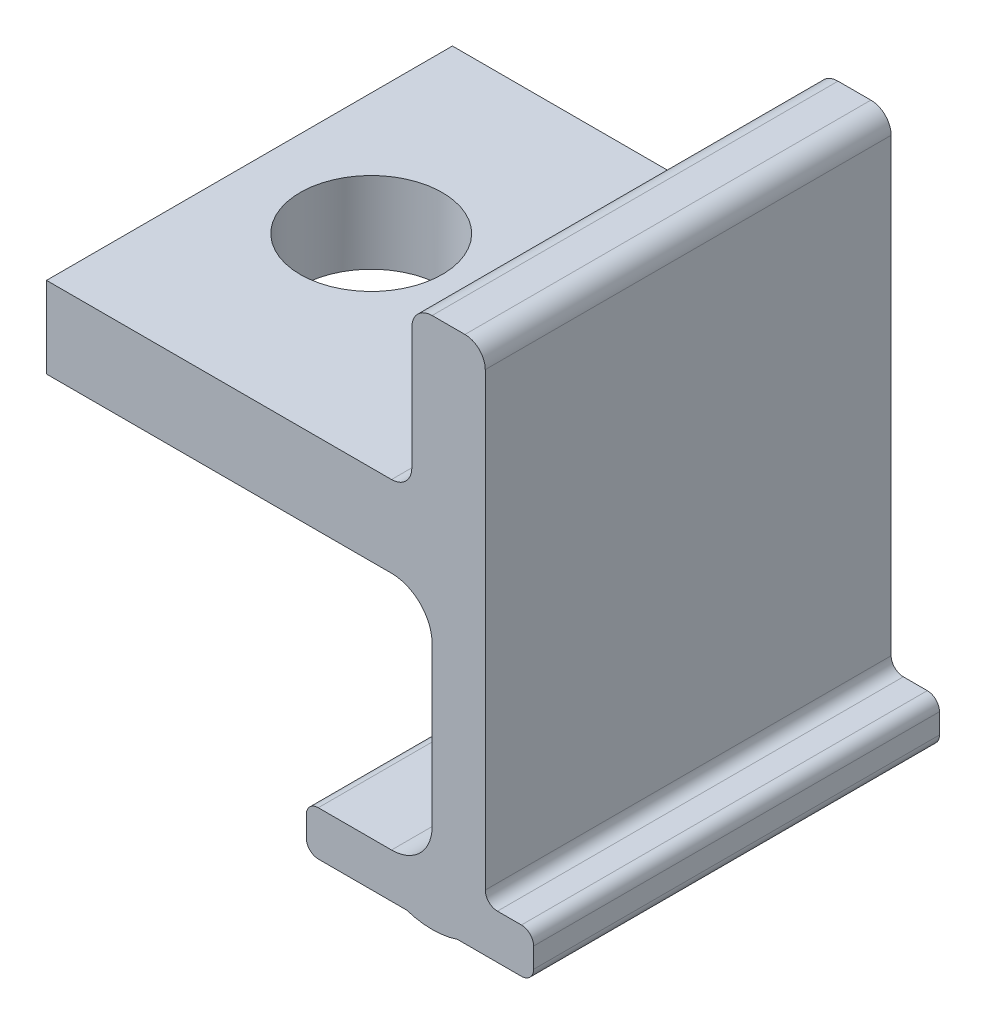
ISO-10303-21;
HEADER;
FILE_DESCRIPTION(('STEP AP214'),'2;1');
FILE_NAME('part.step','',(''),(''),'','','');
FILE_SCHEMA(('AUTOMOTIVE_DESIGN { 1 0 10303 214 1 1 1 1 }'));
ENDSEC;
DATA;
#1=APPLICATION_CONTEXT('core data for automotive mechanical design processes');
#2=APPLICATION_PROTOCOL_DEFINITION('international standard','automotive_design',2000,#1);
#3=PRODUCT_CONTEXT('',#1,'mechanical');
#4=PRODUCT('Part','Part','',(#3));
#5=PRODUCT_RELATED_PRODUCT_CATEGORY('part','',(#4));
#6=PRODUCT_DEFINITION_FORMATION('','',#4);
#7=PRODUCT_DEFINITION_CONTEXT('part definition',#1,'design');
#8=PRODUCT_DEFINITION('design','',#6,#7);
#9=PRODUCT_DEFINITION_SHAPE('','',#8);
#10=(LENGTH_UNIT() NAMED_UNIT(*) SI_UNIT(.MILLI.,.METRE.));
#11=(NAMED_UNIT(*) PLANE_ANGLE_UNIT() SI_UNIT($,.RADIAN.));
#12=(NAMED_UNIT(*) SI_UNIT($,.STERADIAN.) SOLID_ANGLE_UNIT());
#13=UNCERTAINTY_MEASURE_WITH_UNIT(LENGTH_MEASURE(1.E-05),#10,'distance_accuracy_value','');
#14=(GEOMETRIC_REPRESENTATION_CONTEXT(3) GLOBAL_UNCERTAINTY_ASSIGNED_CONTEXT((#13)) GLOBAL_UNIT_ASSIGNED_CONTEXT((#10,
#11,#12)) REPRESENTATION_CONTEXT('',''));
#15=CARTESIAN_POINT('',(0.,0.,0.));
#16=DIRECTION('',(0.,0.,1.));
#17=DIRECTION('',(1.,0.,0.));
#18=AXIS2_PLACEMENT_3D('',#15,#16,#17);
#19=CARTESIAN_POINT('',(5.76408133465163,-7.90419601084502,0.));
#20=DIRECTION('',(0.,-1.,0.));
#21=DIRECTION('',(0.,0.,-1.));
#22=AXIS2_PLACEMENT_3D('',#19,#20,#21);
#23=PLANE('',#22);
#24=DIRECTION('',(0.,0.,1.));
#25=VECTOR('',#24,1.);
#26=CARTESIAN_POINT('',(6.69580398915498,-7.90419601084502,0.));
#27=LINE('',#26,#25);
#28=CARTESIAN_POINT('',(6.69580398915498,-7.90419601084502,0.));
#29=VERTEX_POINT('',#28);
#30=CARTESIAN_POINT('',(6.69580398915498,-7.90419601084502,10.));
#31=VERTEX_POINT('',#30);
#32=EDGE_CURVE('E200',#29,#31,#27,.T.);
#33=ORIENTED_EDGE('',*,*,#32,.T.);
#34=DIRECTION('',(1.,0.,0.));
#35=VECTOR('',#34,1.);
#36=CARTESIAN_POINT('',(5.76408133465163,-7.90419601084502,10.));
#37=LINE('',#36,#35);
#38=CARTESIAN_POINT('',(8.5,-7.90419601084502,10.));
#39=VERTEX_POINT('',#38);
#40=EDGE_CURVE('E219',#31,#39,#37,.T.);
#41=ORIENTED_EDGE('',*,*,#40,.T.);
#42=DIRECTION('',(0.,0.,1.));
#43=VECTOR('',#42,1.);
#44=CARTESIAN_POINT('',(8.5,-7.90419601084502,0.));
#45=LINE('',#44,#43);
#46=CARTESIAN_POINT('',(8.5,-7.90419601084502,0.));
#47=VERTEX_POINT('',#46);
#48=EDGE_CURVE('E218',#47,#39,#45,.T.);
#49=ORIENTED_EDGE('',*,*,#48,.F.);
#50=DIRECTION('',(-1.,0.,0.));
#51=VECTOR('',#50,1.);
#52=CARTESIAN_POINT('',(8.5,-7.90419601084502,0.));
#53=LINE('',#52,#51);
#54=EDGE_CURVE('E11',#47,#29,#53,.T.);
#55=ORIENTED_EDGE('',*,*,#54,.T.);
#56=EDGE_LOOP('',(#33,#41,#49,#55));
#57=FACE_BOUND('',#56,.T.);
#58=ADVANCED_FACE('F40',(#57),#23,.F.);
#59=CARTESIAN_POINT('',(0.,-2.,10.));
#60=DIRECTION('',(1.,0.,0.));
#61=DIRECTION('',(0.,0.,-1.));
#62=AXIS2_PLACEMENT_3D('',#59,#60,#61);
#63=PLANE('',#62);
#64=DIRECTION('',(0.,-1.,0.));
#65=VECTOR('',#64,1.);
#66=CARTESIAN_POINT('',(0.,-2.,0.));
#67=LINE('',#66,#65);
#68=CARTESIAN_POINT('',(0.,0.,0.));
#69=VERTEX_POINT('',#68);
#70=CARTESIAN_POINT('',(0.,-2.,0.));
#71=VERTEX_POINT('',#70);
#72=EDGE_CURVE('E274',#69,#71,#67,.T.);
#73=ORIENTED_EDGE('',*,*,#72,.T.);
#74=DIRECTION('',(0.,0.,-1.));
#75=VECTOR('',#74,1.);
#76=CARTESIAN_POINT('',(0.,-2.,10.));
#77=LINE('',#76,#75);
#78=CARTESIAN_POINT('',(0.,-2.,10.));
#79=VERTEX_POINT('',#78);
#80=EDGE_CURVE('E48',#79,#71,#77,.T.);
#81=ORIENTED_EDGE('',*,*,#80,.F.);
#82=DIRECTION('',(0.,-1.,0.));
#83=VECTOR('',#82,1.);
#84=CARTESIAN_POINT('',(0.,-2.,10.));
#85=LINE('',#84,#83);
#86=CARTESIAN_POINT('',(0.,0.,10.));
#87=VERTEX_POINT('',#86);
#88=EDGE_CURVE('E237',#87,#79,#85,.T.);
#89=ORIENTED_EDGE('',*,*,#88,.F.);
#90=DIRECTION('',(0.,0.,-1.));
#91=VECTOR('',#90,1.);
#92=CARTESIAN_POINT('',(0.,0.,10.));
#93=LINE('',#92,#91);
#94=EDGE_CURVE('E273',#87,#69,#93,.T.);
#95=ORIENTED_EDGE('',*,*,#94,.T.);
#96=EDGE_LOOP('',(#73,#81,#89,#95));
#97=FACE_BOUND('',#96,.T.);
#98=ADVANCED_FACE('F42',(#97),#63,.F.);
#99=CARTESIAN_POINT('',(6.3,-2.,10.));
#100=DIRECTION('',(0.,1.,0.));
#101=DIRECTION('',(-1.,0.,0.));
#102=AXIS2_PLACEMENT_3D('',#99,#100,#101);
#103=PLANE('',#102);
#104=CARTESIAN_POINT('',(3.00000000000038,-2.,4.99999999999996));
#105=DIRECTION('',(0.,1.,0.));
#106=DIRECTION('',(-1.,0.,0.));
#107=AXIS2_PLACEMENT_3D('',#104,#105,#106);
#108=CIRCLE('',#107,1.75);
#109=CARTESIAN_POINT('',(1.25000000000038,-2.,4.99999999999996));
#110=VERTEX_POINT('',#109);
#111=EDGE_CURVE('E235',#110,#110,#108,.T.);
#112=ORIENTED_EDGE('',*,*,#111,.T.);
#113=EDGE_LOOP('',(#112));
#114=FACE_BOUND('',#113,.T.);
#115=DIRECTION('',(1.,0.,0.));
#116=VECTOR('',#115,1.);
#117=CARTESIAN_POINT('',(6.3,-2.,0.));
#118=LINE('',#117,#116);
#119=CARTESIAN_POINT('',(8.5,-2.,0.));
#120=VERTEX_POINT('',#119);
#121=EDGE_CURVE('E277',#71,#120,#118,.T.);
#122=ORIENTED_EDGE('',*,*,#121,.T.);
#123=DIRECTION('',(0.,0.,1.));
#124=VECTOR('',#123,1.);
#125=CARTESIAN_POINT('',(8.5,-2.,0.));
#126=LINE('',#125,#124);
#127=CARTESIAN_POINT('',(8.5,-2.,10.));
#128=VERTEX_POINT('',#127);
#129=EDGE_CURVE('E236',#120,#128,#126,.T.);
#130=ORIENTED_EDGE('',*,*,#129,.T.);
#131=DIRECTION('',(1.,0.,0.));
#132=VECTOR('',#131,1.);
#133=CARTESIAN_POINT('',(6.3,-2.,10.));
#134=LINE('',#133,#132);
#135=EDGE_CURVE('E240',#79,#128,#134,.T.);
#136=ORIENTED_EDGE('',*,*,#135,.F.);
#137=ORIENTED_EDGE('',*,*,#80,.T.);
#138=EDGE_LOOP('',(#122,#130,#136,#137));
#139=FACE_BOUND('',#138,.T.);
#140=ADVANCED_FACE('F357',(#114,#139),#103,.F.);
#141=CARTESIAN_POINT('',(8.87550020016016,-9.,10.));
#142=DIRECTION('',(0.,1.,0.));
#143=DIRECTION('',(-1.,0.,0.));
#144=AXIS2_PLACEMENT_3D('',#141,#142,#143);
#145=PLANE('',#144);
#146=DIRECTION('',(1.,0.,0.));
#147=VECTOR('',#146,1.);
#148=CARTESIAN_POINT('',(8.87550020016016,-9.,10.));
#149=LINE('',#148,#147);
#150=CARTESIAN_POINT('',(6.7,-9.,10.));
#151=VERTEX_POINT('',#150);
#152=CARTESIAN_POINT('',(8.87550020016016,-9.,10.));
#153=VERTEX_POINT('',#152);
#154=EDGE_CURVE('E243',#151,#153,#149,.T.);
#155=ORIENTED_EDGE('',*,*,#154,.F.);
#156=DIRECTION('',(0.,0.,1.));
#157=VECTOR('',#156,1.);
#158=CARTESIAN_POINT('',(6.7,-9.,0.));
#159=LINE('',#158,#157);
#160=CARTESIAN_POINT('',(6.7,-9.,0.));
#161=VERTEX_POINT('',#160);
#162=EDGE_CURVE('E207',#161,#151,#159,.T.);
#163=ORIENTED_EDGE('',*,*,#162,.F.);
#164=DIRECTION('',(1.,0.,0.));
#165=VECTOR('',#164,1.);
#166=CARTESIAN_POINT('',(8.87550020016016,-9.,0.));
#167=LINE('',#166,#165);
#168=CARTESIAN_POINT('',(8.87550020016016,-9.,0.));
#169=VERTEX_POINT('',#168);
#170=EDGE_CURVE('E279',#161,#169,#167,.T.);
#171=ORIENTED_EDGE('',*,*,#170,.T.);
#172=DIRECTION('',(0.,0.,-1.));
#173=VECTOR('',#172,1.);
#174=CARTESIAN_POINT('',(8.87550020016016,-9.,10.));
#175=LINE('',#174,#173);
#176=EDGE_CURVE('E350',#153,#169,#175,.T.);
#177=ORIENTED_EDGE('',*,*,#176,.F.);
#178=EDGE_LOOP('',(#155,#163,#171,#177));
#179=FACE_BOUND('',#178,.T.);
#180=ADVANCED_FACE('F510',(#179),#145,.F.);
#181=CARTESIAN_POINT('',(9.5,-7.1,10.));
#182=DIRECTION('',(0.,0.,-1.));
#183=DIRECTION('',(-1.,0.,0.));
#184=AXIS2_PLACEMENT_3D('',#181,#182,#183);
#185=CYLINDRICAL_SURFACE('',#184,2.);
#186=CARTESIAN_POINT('',(9.5,-7.1,0.));
#187=DIRECTION('',(0.,0.,1.));
#188=DIRECTION('',(1.,0.,0.));
#189=AXIS2_PLACEMENT_3D('',#186,#187,#188);
#190=CIRCLE('',#189,2.);
#191=CARTESIAN_POINT('',(10.1244997998398,-9.,0.));
#192=VERTEX_POINT('',#191);
#193=EDGE_CURVE('E281',#169,#192,#190,.T.);
#194=ORIENTED_EDGE('',*,*,#193,.T.);
#195=DIRECTION('',(0.,0.,-1.));
#196=VECTOR('',#195,1.);
#197=CARTESIAN_POINT('',(10.1244997998398,-9.,10.));
#198=LINE('',#197,#196);
#199=CARTESIAN_POINT('',(10.1244997998398,-9.,10.));
#200=VERTEX_POINT('',#199);
#201=EDGE_CURVE('E347',#200,#192,#198,.T.);
#202=ORIENTED_EDGE('',*,*,#201,.F.);
#203=CARTESIAN_POINT('',(9.5,-7.1,10.));
#204=DIRECTION('',(0.,0.,1.));
#205=DIRECTION('',(1.,0.,0.));
#206=AXIS2_PLACEMENT_3D('',#203,#204,#205);
#207=CIRCLE('',#206,2.);
#208=EDGE_CURVE('E245',#153,#200,#207,.T.);
#209=ORIENTED_EDGE('',*,*,#208,.F.);
#210=ORIENTED_EDGE('',*,*,#176,.T.);
#211=EDGE_LOOP('',(#194,#202,#209,#210));
#212=FACE_BOUND('',#211,.T.);
#213=ADVANCED_FACE('F506',(#212),#185,.T.);
#214=CARTESIAN_POINT('',(11.7,-9.,10.));
#215=DIRECTION('',(0.,1.,0.));
#216=DIRECTION('',(0.,0.,1.));
#217=AXIS2_PLACEMENT_3D('',#214,#215,#216);
#218=PLANE('',#217);
#219=DIRECTION('',(1.,0.,0.));
#220=VECTOR('',#219,1.);
#221=CARTESIAN_POINT('',(11.7,-9.,0.));
#222=LINE('',#221,#220);
#223=CARTESIAN_POINT('',(11.7,-9.,0.));
#224=VERTEX_POINT('',#223);
#225=EDGE_CURVE('E283',#192,#224,#222,.T.);
#226=ORIENTED_EDGE('',*,*,#225,.T.);
#227=DIRECTION('',(0.,0.,-1.));
#228=VECTOR('',#227,1.);
#229=CARTESIAN_POINT('',(11.7,-9.,10.));
#230=LINE('',#229,#228);
#231=CARTESIAN_POINT('',(11.7,-9.,10.));
#232=VERTEX_POINT('',#231);
#233=EDGE_CURVE('E344',#232,#224,#230,.T.);
#234=ORIENTED_EDGE('',*,*,#233,.F.);
#235=DIRECTION('',(1.,0.,0.));
#236=VECTOR('',#235,1.);
#237=CARTESIAN_POINT('',(11.7,-9.,10.));
#238=LINE('',#237,#236);
#239=EDGE_CURVE('E247',#200,#232,#238,.T.);
#240=ORIENTED_EDGE('',*,*,#239,.F.);
#241=ORIENTED_EDGE('',*,*,#201,.T.);
#242=EDGE_LOOP('',(#226,#234,#240,#241));
#243=FACE_BOUND('',#242,.T.);
#244=ADVANCED_FACE('F501',(#243),#218,.F.);
#245=CARTESIAN_POINT('',(11.7,-8.7,10.));
#246=DIRECTION('',(0.,0.,-1.));
#247=DIRECTION('',(-1.,0.,0.));
#248=AXIS2_PLACEMENT_3D('',#245,#246,#247);
#249=CYLINDRICAL_SURFACE('',#248,0.3);
#250=CARTESIAN_POINT('',(11.7,-8.7,0.));
#251=DIRECTION('',(0.,0.,1.));
#252=DIRECTION('',(-1.,0.,0.));
#253=AXIS2_PLACEMENT_3D('',#250,#251,#252);
#254=CIRCLE('',#253,0.3);
#255=CARTESIAN_POINT('',(12.,-8.7,0.));
#256=VERTEX_POINT('',#255);
#257=EDGE_CURVE('E285',#224,#256,#254,.T.);
#258=ORIENTED_EDGE('',*,*,#257,.T.);
#259=DIRECTION('',(0.,0.,-1.));
#260=VECTOR('',#259,1.);
#261=CARTESIAN_POINT('',(12.,-8.7,10.));
#262=LINE('',#261,#260);
#263=CARTESIAN_POINT('',(12.,-8.7,10.));
#264=VERTEX_POINT('',#263);
#265=EDGE_CURVE('E341',#264,#256,#262,.T.);
#266=ORIENTED_EDGE('',*,*,#265,.F.);
#267=CARTESIAN_POINT('',(11.7,-8.7,10.));
#268=DIRECTION('',(0.,0.,1.));
#269=DIRECTION('',(-1.,0.,0.));
#270=AXIS2_PLACEMENT_3D('',#267,#268,#269);
#271=CIRCLE('',#270,0.3);
#272=EDGE_CURVE('E249',#232,#264,#271,.T.);
#273=ORIENTED_EDGE('',*,*,#272,.F.);
#274=ORIENTED_EDGE('',*,*,#233,.T.);
#275=EDGE_LOOP('',(#258,#266,#273,#274));
#276=FACE_BOUND('',#275,.T.);
#277=ADVANCED_FACE('F495',(#276),#249,.T.);
#278=CARTESIAN_POINT('',(12.,-8.7,10.));
#279=DIRECTION('',(-1.,0.,0.));
#280=DIRECTION('',(0.,-1.,0.));
#281=AXIS2_PLACEMENT_3D('',#278,#279,#280);
#282=PLANE('',#281);
#283=DIRECTION('',(0.,1.,0.));
#284=VECTOR('',#283,1.);
#285=CARTESIAN_POINT('',(12.,-8.7,0.));
#286=LINE('',#285,#284);
#287=CARTESIAN_POINT('',(12.,-8.20419601084502,0.));
#288=VERTEX_POINT('',#287);
#289=EDGE_CURVE('E287',#256,#288,#286,.T.);
#290=ORIENTED_EDGE('',*,*,#289,.T.);
#291=DIRECTION('',(0.,0.,-1.));
#292=VECTOR('',#291,1.);
#293=CARTESIAN_POINT('',(12.,-8.20419601084502,10.));
#294=LINE('',#293,#292);
#295=CARTESIAN_POINT('',(12.,-8.20419601084502,10.));
#296=VERTEX_POINT('',#295);
#297=EDGE_CURVE('E338',#296,#288,#294,.T.);
#298=ORIENTED_EDGE('',*,*,#297,.F.);
#299=DIRECTION('',(0.,1.,0.));
#300=VECTOR('',#299,1.);
#301=CARTESIAN_POINT('',(12.,-8.7,10.));
#302=LINE('',#301,#300);
#303=EDGE_CURVE('E251',#264,#296,#302,.T.);
#304=ORIENTED_EDGE('',*,*,#303,.F.);
#305=ORIENTED_EDGE('',*,*,#265,.T.);
#306=EDGE_LOOP('',(#290,#298,#304,#305));
#307=FACE_BOUND('',#306,.T.);
#308=ADVANCED_FACE('F491',(#307),#282,.F.);
#309=CARTESIAN_POINT('',(11.7,-8.20419601084502,10.));
#310=DIRECTION('',(0.,0.,-1.));
#311=DIRECTION('',(-1.,0.,0.));
#312=AXIS2_PLACEMENT_3D('',#309,#310,#311);
#313=CYLINDRICAL_SURFACE('',#312,0.300000000000001);
#314=CARTESIAN_POINT('',(11.7,-8.20419601084502,0.));
#315=DIRECTION('',(0.,0.,1.));
#316=DIRECTION('',(1.,0.,0.));
#317=AXIS2_PLACEMENT_3D('',#314,#315,#316);
#318=CIRCLE('',#317,0.300000000000001);
#319=CARTESIAN_POINT('',(11.7,-7.90419601084501,0.));
#320=VERTEX_POINT('',#319);
#321=EDGE_CURVE('E289',#288,#320,#318,.T.);
#322=ORIENTED_EDGE('',*,*,#321,.T.);
#323=DIRECTION('',(0.,0.,-1.));
#324=VECTOR('',#323,1.);
#325=CARTESIAN_POINT('',(11.7,-7.90419601084501,10.));
#326=LINE('',#325,#324);
#327=CARTESIAN_POINT('',(11.7,-7.90419601084501,10.));
#328=VERTEX_POINT('',#327);
#329=EDGE_CURVE('E335',#328,#320,#326,.T.);
#330=ORIENTED_EDGE('',*,*,#329,.F.);
#331=CARTESIAN_POINT('',(11.7,-8.20419601084502,10.));
#332=DIRECTION('',(0.,0.,1.));
#333=DIRECTION('',(1.,0.,0.));
#334=AXIS2_PLACEMENT_3D('',#331,#332,#333);
#335=CIRCLE('',#334,0.300000000000001);
#336=EDGE_CURVE('E253',#296,#328,#335,.T.);
#337=ORIENTED_EDGE('',*,*,#336,.F.);
#338=ORIENTED_EDGE('',*,*,#297,.T.);
#339=EDGE_LOOP('',(#322,#330,#337,#338));
#340=FACE_BOUND('',#339,.T.);
#341=ADVANCED_FACE('F486',(#340),#313,.T.);
#342=CARTESIAN_POINT('',(11.1094202567787,-7.90419601084501,10.));
#343=DIRECTION('',(0.,-1.,0.));
#344=DIRECTION('',(1.,0.,0.));
#345=AXIS2_PLACEMENT_3D('',#342,#343,#344);
#346=PLANE('',#345);
#347=DIRECTION('',(-1.,0.,0.));
#348=VECTOR('',#347,1.);
#349=CARTESIAN_POINT('',(11.1094202567787,-7.90419601084501,0.));
#350=LINE('',#349,#348);
#351=CARTESIAN_POINT('',(11.1094202567787,-7.90419601084501,0.));
#352=VERTEX_POINT('',#351);
#353=EDGE_CURVE('E291',#320,#352,#350,.T.);
#354=ORIENTED_EDGE('',*,*,#353,.T.);
#355=DIRECTION('',(0.,0.,-1.));
#356=VECTOR('',#355,1.);
#357=CARTESIAN_POINT('',(11.1094202567787,-7.90419601084501,10.));
#358=LINE('',#357,#356);
#359=CARTESIAN_POINT('',(11.1094202567787,-7.90419601084501,10.));
#360=VERTEX_POINT('',#359);
#361=EDGE_CURVE('E332',#360,#352,#358,.T.);
#362=ORIENTED_EDGE('',*,*,#361,.F.);
#363=DIRECTION('',(-1.,0.,0.));
#364=VECTOR('',#363,1.);
#365=CARTESIAN_POINT('',(11.1094202567787,-7.90419601084501,10.));
#366=LINE('',#365,#364);
#367=EDGE_CURVE('E255',#328,#360,#366,.T.);
#368=ORIENTED_EDGE('',*,*,#367,.F.);
#369=ORIENTED_EDGE('',*,*,#329,.T.);
#370=EDGE_LOOP('',(#354,#362,#368,#369));
#371=FACE_BOUND('',#370,.T.);
#372=ADVANCED_FACE('F480',(#371),#346,.F.);
#373=CARTESIAN_POINT('',(11.1094202567787,-7.60419601084501,10.));
#374=DIRECTION('',(0.,0.,-1.));
#375=DIRECTION('',(-1.,0.,0.));
#376=AXIS2_PLACEMENT_3D('',#373,#374,#375);
#377=CYLINDRICAL_SURFACE('',#376,0.300000000000001);
#378=CARTESIAN_POINT('',(11.1094202567787,-7.60419601084501,0.));
#379=DIRECTION('',(0.,0.,-1.));
#380=DIRECTION('',(1.,0.,0.));
#381=AXIS2_PLACEMENT_3D('',#378,#379,#380);
#382=CIRCLE('',#381,0.300000000000001);
#383=CARTESIAN_POINT('',(10.8094202567787,-7.60419601084501,0.));
#384=VERTEX_POINT('',#383);
#385=EDGE_CURVE('E293',#352,#384,#382,.T.);
#386=ORIENTED_EDGE('',*,*,#385,.T.);
#387=DIRECTION('',(0.,0.,-1.));
#388=VECTOR('',#387,1.);
#389=CARTESIAN_POINT('',(10.8094202567787,-7.60419601084501,10.));
#390=LINE('',#389,#388);
#391=CARTESIAN_POINT('',(10.8094202567787,-7.60419601084501,10.));
#392=VERTEX_POINT('',#391);
#393=EDGE_CURVE('E329',#392,#384,#390,.T.);
#394=ORIENTED_EDGE('',*,*,#393,.F.);
#395=CARTESIAN_POINT('',(11.1094202567787,-7.60419601084501,10.));
#396=DIRECTION('',(0.,0.,-1.));
#397=DIRECTION('',(1.,0.,0.));
#398=AXIS2_PLACEMENT_3D('',#395,#396,#397);
#399=CIRCLE('',#398,0.300000000000001);
#400=EDGE_CURVE('E257',#360,#392,#399,.T.);
#401=ORIENTED_EDGE('',*,*,#400,.F.);
#402=ORIENTED_EDGE('',*,*,#361,.T.);
#403=EDGE_LOOP('',(#386,#394,#401,#402));
#404=FACE_BOUND('',#403,.T.);
#405=ADVANCED_FACE('F476',(#404),#377,.F.);
#406=CARTESIAN_POINT('',(10.8094202567787,3.5,10.));
#407=DIRECTION('',(-1.,0.,0.));
#408=DIRECTION('',(0.,-1.,0.));
#409=AXIS2_PLACEMENT_3D('',#406,#407,#408);
#410=PLANE('',#409);
#411=DIRECTION('',(0.,1.,0.));
#412=VECTOR('',#411,1.);
#413=CARTESIAN_POINT('',(10.8094202567787,3.5,0.));
#414=LINE('',#413,#412);
#415=CARTESIAN_POINT('',(10.8094202567787,3.5,0.));
#416=VERTEX_POINT('',#415);
#417=EDGE_CURVE('E295',#384,#416,#414,.T.);
#418=ORIENTED_EDGE('',*,*,#417,.T.);
#419=DIRECTION('',(0.,0.,-1.));
#420=VECTOR('',#419,1.);
#421=CARTESIAN_POINT('',(10.8094202567787,3.5,10.));
#422=LINE('',#421,#420);
#423=CARTESIAN_POINT('',(10.8094202567787,3.5,10.));
#424=VERTEX_POINT('',#423);
#425=EDGE_CURVE('E326',#424,#416,#422,.T.);
#426=ORIENTED_EDGE('',*,*,#425,.F.);
#427=DIRECTION('',(0.,1.,0.));
#428=VECTOR('',#427,1.);
#429=CARTESIAN_POINT('',(10.8094202567787,3.5,10.));
#430=LINE('',#429,#428);
#431=EDGE_CURVE('E259',#392,#424,#430,.T.);
#432=ORIENTED_EDGE('',*,*,#431,.F.);
#433=ORIENTED_EDGE('',*,*,#393,.T.);
#434=EDGE_LOOP('',(#418,#426,#432,#433));
#435=FACE_BOUND('',#434,.T.);
#436=ADVANCED_FACE('F471',(#435),#410,.F.);
#437=CARTESIAN_POINT('',(10.3094202567787,3.5,10.));
#438=DIRECTION('',(0.,0.,-1.));
#439=DIRECTION('',(-1.,0.,0.));
#440=AXIS2_PLACEMENT_3D('',#437,#438,#439);
#441=CYLINDRICAL_SURFACE('',#440,0.500000000000002);
#442=CARTESIAN_POINT('',(10.3094202567787,3.5,0.));
#443=DIRECTION('',(0.,0.,1.));
#444=DIRECTION('',(1.,0.,0.));
#445=AXIS2_PLACEMENT_3D('',#442,#443,#444);
#446=CIRCLE('',#445,0.500000000000002);
#447=CARTESIAN_POINT('',(10.3094202567787,4.,0.));
#448=VERTEX_POINT('',#447);
#449=EDGE_CURVE('E297',#416,#448,#446,.T.);
#450=ORIENTED_EDGE('',*,*,#449,.T.);
#451=DIRECTION('',(0.,0.,-1.));
#452=VECTOR('',#451,1.);
#453=CARTESIAN_POINT('',(10.3094202567787,4.,10.));
#454=LINE('',#453,#452);
#455=CARTESIAN_POINT('',(10.3094202567787,4.,10.));
#456=VERTEX_POINT('',#455);
#457=EDGE_CURVE('E323',#456,#448,#454,.T.);
#458=ORIENTED_EDGE('',*,*,#457,.F.);
#459=CARTESIAN_POINT('',(10.3094202567787,3.5,10.));
#460=DIRECTION('',(0.,0.,1.));
#461=DIRECTION('',(1.,0.,0.));
#462=AXIS2_PLACEMENT_3D('',#459,#460,#461);
#463=CIRCLE('',#462,0.500000000000002);
#464=EDGE_CURVE('E261',#424,#456,#463,.T.);
#465=ORIENTED_EDGE('',*,*,#464,.F.);
#466=ORIENTED_EDGE('',*,*,#425,.T.);
#467=EDGE_LOOP('',(#450,#458,#465,#466));
#468=FACE_BOUND('',#467,.T.);
#469=ADVANCED_FACE('F465',(#468),#441,.T.);
#470=CARTESIAN_POINT('',(10.3094202567787,4.,10.));
#471=DIRECTION('',(0.,-1.,0.));
#472=DIRECTION('',(1.,0.,0.));
#473=AXIS2_PLACEMENT_3D('',#470,#471,#472);
#474=PLANE('',#473);
#475=DIRECTION('',(-1.,0.,0.));
#476=VECTOR('',#475,1.);
#477=CARTESIAN_POINT('',(10.3094202567787,4.,0.));
#478=LINE('',#477,#476);
#479=CARTESIAN_POINT('',(9.5,4.,0.));
#480=VERTEX_POINT('',#479);
#481=EDGE_CURVE('E299',#448,#480,#478,.T.);
#482=ORIENTED_EDGE('',*,*,#481,.T.);
#483=DIRECTION('',(0.,0.,-1.));
#484=VECTOR('',#483,1.);
#485=CARTESIAN_POINT('',(9.5,4.,10.));
#486=LINE('',#485,#484);
#487=CARTESIAN_POINT('',(9.5,4.,10.));
#488=VERTEX_POINT('',#487);
#489=EDGE_CURVE('E320',#488,#480,#486,.T.);
#490=ORIENTED_EDGE('',*,*,#489,.F.);
#491=DIRECTION('',(-1.,0.,0.));
#492=VECTOR('',#491,1.);
#493=CARTESIAN_POINT('',(10.3094202567787,4.,10.));
#494=LINE('',#493,#492);
#495=EDGE_CURVE('E263',#456,#488,#494,.T.);
#496=ORIENTED_EDGE('',*,*,#495,.F.);
#497=ORIENTED_EDGE('',*,*,#457,.T.);
#498=EDGE_LOOP('',(#482,#490,#496,#497));
#499=FACE_BOUND('',#498,.T.);
#500=ADVANCED_FACE('F461',(#499),#474,.F.);
#501=CARTESIAN_POINT('',(9.5,3.5,10.));
#502=DIRECTION('',(0.,0.,-1.));
#503=DIRECTION('',(-1.,0.,0.));
#504=AXIS2_PLACEMENT_3D('',#501,#502,#503);
#505=CYLINDRICAL_SURFACE('',#504,0.500000000000001);
#506=CARTESIAN_POINT('',(9.5,3.5,0.));
#507=DIRECTION('',(0.,0.,1.));
#508=DIRECTION('',(1.,0.,0.));
#509=AXIS2_PLACEMENT_3D('',#506,#507,#508);
#510=CIRCLE('',#509,0.500000000000001);
#511=CARTESIAN_POINT('',(9.,3.5,0.));
#512=VERTEX_POINT('',#511);
#513=EDGE_CURVE('E301',#480,#512,#510,.T.);
#514=ORIENTED_EDGE('',*,*,#513,.T.);
#515=DIRECTION('',(0.,0.,-1.));
#516=VECTOR('',#515,1.);
#517=CARTESIAN_POINT('',(9.,3.5,10.));
#518=LINE('',#517,#516);
#519=CARTESIAN_POINT('',(9.,3.5,10.));
#520=VERTEX_POINT('',#519);
#521=EDGE_CURVE('E317',#520,#512,#518,.T.);
#522=ORIENTED_EDGE('',*,*,#521,.F.);
#523=CARTESIAN_POINT('',(9.5,3.5,10.));
#524=DIRECTION('',(0.,0.,1.));
#525=DIRECTION('',(1.,0.,0.));
#526=AXIS2_PLACEMENT_3D('',#523,#524,#525);
#527=CIRCLE('',#526,0.500000000000001);
#528=EDGE_CURVE('E265',#488,#520,#527,.T.);
#529=ORIENTED_EDGE('',*,*,#528,.F.);
#530=ORIENTED_EDGE('',*,*,#489,.T.);
#531=EDGE_LOOP('',(#514,#522,#529,#530));
#532=FACE_BOUND('',#531,.T.);
#533=ADVANCED_FACE('F456',(#532),#505,.T.);
#534=CARTESIAN_POINT('',(9.,3.5,10.));
#535=DIRECTION('',(1.,0.,0.));
#536=DIRECTION('',(0.,1.,0.));
#537=AXIS2_PLACEMENT_3D('',#534,#535,#536);
#538=PLANE('',#537);
#539=DIRECTION('',(0.,-1.,0.));
#540=VECTOR('',#539,1.);
#541=CARTESIAN_POINT('',(9.,3.5,0.));
#542=LINE('',#541,#540);
#543=CARTESIAN_POINT('',(9.,0.500000000000003,0.));
#544=VERTEX_POINT('',#543);
#545=EDGE_CURVE('E303',#512,#544,#542,.T.);
#546=ORIENTED_EDGE('',*,*,#545,.T.);
#547=DIRECTION('',(0.,0.,-1.));
#548=VECTOR('',#547,1.);
#549=CARTESIAN_POINT('',(9.,0.500000000000003,10.));
#550=LINE('',#549,#548);
#551=CARTESIAN_POINT('',(9.,0.500000000000003,10.));
#552=VERTEX_POINT('',#551);
#553=EDGE_CURVE('E314',#552,#544,#550,.T.);
#554=ORIENTED_EDGE('',*,*,#553,.F.);
#555=DIRECTION('',(0.,-1.,0.));
#556=VECTOR('',#555,1.);
#557=CARTESIAN_POINT('',(9.,3.5,10.));
#558=LINE('',#557,#556);
#559=EDGE_CURVE('E267',#520,#552,#558,.T.);
#560=ORIENTED_EDGE('',*,*,#559,.F.);
#561=ORIENTED_EDGE('',*,*,#521,.T.);
#562=EDGE_LOOP('',(#546,#554,#560,#561));
#563=FACE_BOUND('',#562,.T.);
#564=ADVANCED_FACE('F450',(#563),#538,.F.);
#565=CARTESIAN_POINT('',(8.5,0.500000000000003,10.));
#566=DIRECTION('',(0.,0.,-1.));
#567=DIRECTION('',(-1.,0.,0.));
#568=AXIS2_PLACEMENT_3D('',#565,#566,#567);
#569=CYLINDRICAL_SURFACE('',#568,0.500000000000003);
#570=CARTESIAN_POINT('',(8.5,0.500000000000003,0.));
#571=DIRECTION('',(0.,0.,-1.));
#572=DIRECTION('',(-1.,0.,0.));
#573=AXIS2_PLACEMENT_3D('',#570,#571,#572);
#574=CIRCLE('',#573,0.500000000000003);
#575=CARTESIAN_POINT('',(8.5,0.,0.));
#576=VERTEX_POINT('',#575);
#577=EDGE_CURVE('E305',#544,#576,#574,.T.);
#578=ORIENTED_EDGE('',*,*,#577,.T.);
#579=DIRECTION('',(0.,0.,-1.));
#580=VECTOR('',#579,1.);
#581=CARTESIAN_POINT('',(8.5,0.,10.));
#582=LINE('',#581,#580);
#583=CARTESIAN_POINT('',(8.5,0.,10.));
#584=VERTEX_POINT('',#583);
#585=EDGE_CURVE('E311',#584,#576,#582,.T.);
#586=ORIENTED_EDGE('',*,*,#585,.F.);
#587=CARTESIAN_POINT('',(8.5,0.500000000000003,10.));
#588=DIRECTION('',(0.,0.,-1.));
#589=DIRECTION('',(-1.,0.,0.));
#590=AXIS2_PLACEMENT_3D('',#587,#588,#589);
#591=CIRCLE('',#590,0.500000000000003);
#592=EDGE_CURVE('E269',#552,#584,#591,.T.);
#593=ORIENTED_EDGE('',*,*,#592,.F.);
#594=ORIENTED_EDGE('',*,*,#553,.T.);
#595=EDGE_LOOP('',(#578,#586,#593,#594));
#596=FACE_BOUND('',#595,.T.);
#597=ADVANCED_FACE('F445',(#596),#569,.F.);
#598=CARTESIAN_POINT('',(0.,0.,10.));
#599=DIRECTION('',(0.,-1.,0.));
#600=DIRECTION('',(0.,0.,-1.));
#601=AXIS2_PLACEMENT_3D('',#598,#599,#600);
#602=PLANE('',#601);
#603=CARTESIAN_POINT('',(3.00000000000038,0.,4.99999999999996));
#604=DIRECTION('',(0.,1.,0.));
#605=DIRECTION('',(0.,0.,1.));
#606=AXIS2_PLACEMENT_3D('',#603,#604,#605);
#607=CIRCLE('',#606,1.75);
#608=CARTESIAN_POINT('',(3.00000000000038,0.,6.74999999999995));
#609=VERTEX_POINT('',#608);
#610=EDGE_CURVE('E232',#609,#609,#607,.T.);
#611=ORIENTED_EDGE('',*,*,#610,.F.);
#612=EDGE_LOOP('',(#611));
#613=FACE_BOUND('',#612,.T.);
#614=DIRECTION('',(-1.,0.,0.));
#615=VECTOR('',#614,1.);
#616=CARTESIAN_POINT('',(0.,0.,0.));
#617=LINE('',#616,#615);
#618=EDGE_CURVE('E241',#576,#69,#617,.T.);
#619=ORIENTED_EDGE('',*,*,#618,.T.);
#620=ORIENTED_EDGE('',*,*,#94,.F.);
#621=DIRECTION('',(-1.,0.,0.));
#622=VECTOR('',#621,1.);
#623=CARTESIAN_POINT('',(8.,0.,10.));
#624=LINE('',#623,#622);
#625=EDGE_CURVE('E271',#584,#87,#624,.T.);
#626=ORIENTED_EDGE('',*,*,#625,.F.);
#627=ORIENTED_EDGE('',*,*,#585,.T.);
#628=EDGE_LOOP('',(#619,#620,#626,#627));
#629=FACE_BOUND('',#628,.T.);
#630=ADVANCED_FACE('F440',(#613,#629),#602,.F.);
#631=CARTESIAN_POINT('',(8.5,0.500000000000003,10.));
#632=DIRECTION('',(0.,0.,-1.));
#633=DIRECTION('',(-1.,0.,0.));
#634=AXIS2_PLACEMENT_3D('',#631,#632,#633);
#635=PLANE('',#634);
#636=ORIENTED_EDGE('',*,*,#40,.F.);
#637=CARTESIAN_POINT('',(6.69580398915498,-8.2,10.));
#638=DIRECTION('',(0.,0.,-1.));
#639=DIRECTION('',(1.,0.,0.));
#640=AXIS2_PLACEMENT_3D('',#637,#638,#639);
#641=CIRCLE('',#640,0.295803989154981);
#642=CARTESIAN_POINT('',(6.4,-8.2,10.));
#643=VERTEX_POINT('',#642);
#644=EDGE_CURVE('E55',#643,#31,#641,.T.);
#645=ORIENTED_EDGE('',*,*,#644,.F.);
#646=DIRECTION('',(0.,1.,0.));
#647=VECTOR('',#646,1.);
#648=CARTESIAN_POINT('',(6.4,-8.2,10.));
#649=LINE('',#648,#647);
#650=CARTESIAN_POINT('',(6.4,-8.7,10.));
#651=VERTEX_POINT('',#650);
#652=EDGE_CURVE('E216',#651,#643,#649,.T.);
#653=ORIENTED_EDGE('',*,*,#652,.F.);
#654=CARTESIAN_POINT('',(6.7,-8.7,10.));
#655=DIRECTION('',(0.,0.,-1.));
#656=DIRECTION('',(1.,0.,0.));
#657=AXIS2_PLACEMENT_3D('',#654,#655,#656);
#658=CIRCLE('',#657,0.300000000000001);
#659=EDGE_CURVE('E406',#151,#651,#658,.T.);
#660=ORIENTED_EDGE('',*,*,#659,.F.);
#661=ORIENTED_EDGE('',*,*,#154,.T.);
#662=ORIENTED_EDGE('',*,*,#208,.T.);
#663=ORIENTED_EDGE('',*,*,#239,.T.);
#664=ORIENTED_EDGE('',*,*,#272,.T.);
#665=ORIENTED_EDGE('',*,*,#303,.T.);
#666=ORIENTED_EDGE('',*,*,#336,.T.);
#667=ORIENTED_EDGE('',*,*,#367,.T.);
#668=ORIENTED_EDGE('',*,*,#400,.T.);
#669=ORIENTED_EDGE('',*,*,#431,.T.);
#670=ORIENTED_EDGE('',*,*,#464,.T.);
#671=ORIENTED_EDGE('',*,*,#495,.T.);
#672=ORIENTED_EDGE('',*,*,#528,.T.);
#673=ORIENTED_EDGE('',*,*,#559,.T.);
#674=ORIENTED_EDGE('',*,*,#592,.T.);
#675=ORIENTED_EDGE('',*,*,#625,.T.);
#676=ORIENTED_EDGE('',*,*,#88,.T.);
#677=ORIENTED_EDGE('',*,*,#135,.T.);
#678=CARTESIAN_POINT('',(8.5,-3.,10.));
#679=DIRECTION('',(0.,0.,1.));
#680=DIRECTION('',(-1.,0.,0.));
#681=AXIS2_PLACEMENT_3D('',#678,#679,#680);
#682=CIRCLE('',#681,0.999999999999999);
#683=CARTESIAN_POINT('',(9.5,-3.,10.));
#684=VERTEX_POINT('',#683);
#685=EDGE_CURVE('E417',#684,#128,#682,.T.);
#686=ORIENTED_EDGE('',*,*,#685,.F.);
#687=DIRECTION('',(0.,1.,0.));
#688=VECTOR('',#687,1.);
#689=CARTESIAN_POINT('',(9.5,-3.,10.));
#690=LINE('',#689,#688);
#691=CARTESIAN_POINT('',(9.5,-6.90419601084502,10.));
#692=VERTEX_POINT('',#691);
#693=EDGE_CURVE('E423',#692,#684,#690,.T.);
#694=ORIENTED_EDGE('',*,*,#693,.F.);
#695=CARTESIAN_POINT('',(8.5,-6.90419601084502,10.));
#696=DIRECTION('',(0.,0.,1.));
#697=DIRECTION('',(1.,0.,0.));
#698=AXIS2_PLACEMENT_3D('',#695,#696,#697);
#699=CIRCLE('',#698,1.);
#700=EDGE_CURVE('E421',#39,#692,#699,.T.);
#701=ORIENTED_EDGE('',*,*,#700,.F.);
#702=EDGE_LOOP('',(#636,#645,#653,#660,#661,#662,#663,#664,#665,#666,#667,#668,#669,#670,#671,
#672,#673,#674,#675,#676,#677,#686,#694,#701));
#703=FACE_BOUND('',#702,.T.);
#704=ADVANCED_FACE('F372',(#703),#635,.F.);
#705=CARTESIAN_POINT('',(8.5,0.500000000000003,0.));
#706=DIRECTION('',(0.,0.,-1.));
#707=DIRECTION('',(-1.,0.,0.));
#708=AXIS2_PLACEMENT_3D('',#705,#706,#707);
#709=PLANE('',#708);
#710=CARTESIAN_POINT('',(6.69580398915498,-8.2,0.));
#711=DIRECTION('',(0.,0.,-1.));
#712=DIRECTION('',(1.,0.,0.));
#713=AXIS2_PLACEMENT_3D('',#710,#711,#712);
#714=CIRCLE('',#713,0.295803989154981);
#715=CARTESIAN_POINT('',(6.4,-8.2,0.));
#716=VERTEX_POINT('',#715);
#717=EDGE_CURVE('E203',#716,#29,#714,.T.);
#718=ORIENTED_EDGE('',*,*,#717,.T.);
#719=ORIENTED_EDGE('',*,*,#54,.F.);
#720=CARTESIAN_POINT('',(8.5,-6.90419601084502,0.));
#721=DIRECTION('',(0.,0.,1.));
#722=DIRECTION('',(1.,0.,0.));
#723=AXIS2_PLACEMENT_3D('',#720,#721,#722);
#724=CIRCLE('',#723,1.);
#725=CARTESIAN_POINT('',(9.5,-6.90419601084502,0.));
#726=VERTEX_POINT('',#725);
#727=EDGE_CURVE('E63',#47,#726,#724,.T.);
#728=ORIENTED_EDGE('',*,*,#727,.T.);
#729=DIRECTION('',(0.,1.,0.));
#730=VECTOR('',#729,1.);
#731=CARTESIAN_POINT('',(9.5,-3.,0.));
#732=LINE('',#731,#730);
#733=CARTESIAN_POINT('',(9.5,-3.,0.));
#734=VERTEX_POINT('',#733);
#735=EDGE_CURVE('E228',#726,#734,#732,.T.);
#736=ORIENTED_EDGE('',*,*,#735,.T.);
#737=CARTESIAN_POINT('',(8.5,-3.,0.));
#738=DIRECTION('',(0.,0.,1.));
#739=DIRECTION('',(-1.,0.,0.));
#740=AXIS2_PLACEMENT_3D('',#737,#738,#739);
#741=CIRCLE('',#740,0.999999999999999);
#742=EDGE_CURVE('E223',#734,#120,#741,.T.);
#743=ORIENTED_EDGE('',*,*,#742,.T.);
#744=ORIENTED_EDGE('',*,*,#121,.F.);
#745=ORIENTED_EDGE('',*,*,#72,.F.);
#746=ORIENTED_EDGE('',*,*,#618,.F.);
#747=ORIENTED_EDGE('',*,*,#577,.F.);
#748=ORIENTED_EDGE('',*,*,#545,.F.);
#749=ORIENTED_EDGE('',*,*,#513,.F.);
#750=ORIENTED_EDGE('',*,*,#481,.F.);
#751=ORIENTED_EDGE('',*,*,#449,.F.);
#752=ORIENTED_EDGE('',*,*,#417,.F.);
#753=ORIENTED_EDGE('',*,*,#385,.F.);
#754=ORIENTED_EDGE('',*,*,#353,.F.);
#755=ORIENTED_EDGE('',*,*,#321,.F.);
#756=ORIENTED_EDGE('',*,*,#289,.F.);
#757=ORIENTED_EDGE('',*,*,#257,.F.);
#758=ORIENTED_EDGE('',*,*,#225,.F.);
#759=ORIENTED_EDGE('',*,*,#193,.F.);
#760=ORIENTED_EDGE('',*,*,#170,.F.);
#761=CARTESIAN_POINT('',(6.7,-8.7,0.));
#762=DIRECTION('',(0.,0.,-1.));
#763=DIRECTION('',(1.,0.,0.));
#764=AXIS2_PLACEMENT_3D('',#761,#762,#763);
#765=CIRCLE('',#764,0.300000000000001);
#766=CARTESIAN_POINT('',(6.4,-8.7,0.));
#767=VERTEX_POINT('',#766);
#768=EDGE_CURVE('E215',#161,#767,#765,.T.);
#769=ORIENTED_EDGE('',*,*,#768,.T.);
#770=DIRECTION('',(0.,1.,0.));
#771=VECTOR('',#770,1.);
#772=CARTESIAN_POINT('',(6.4,-8.2,0.));
#773=LINE('',#772,#771);
#774=EDGE_CURVE('E208',#767,#716,#773,.T.);
#775=ORIENTED_EDGE('',*,*,#774,.T.);
#776=EDGE_LOOP('',(#718,#719,#728,#736,#743,#744,#745,#746,#747,#748,#749,#750,#751,#752,#753,
#754,#755,#756,#757,#758,#759,#760,#769,#775));
#777=FACE_BOUND('',#776,.T.);
#778=ADVANCED_FACE('F212',(#777),#709,.T.);
#779=CARTESIAN_POINT('',(3.00000000000038,0.,4.99999999999996));
#780=DIRECTION('',(0.,1.,0.));
#781=DIRECTION('',(0.,0.,1.));
#782=AXIS2_PLACEMENT_3D('',#779,#780,#781);
#783=CYLINDRICAL_SURFACE('',#782,1.75);
#784=ORIENTED_EDGE('',*,*,#610,.T.);
#785=EDGE_LOOP('',(#784));
#786=FACE_BOUND('',#785,.T.);
#787=ORIENTED_EDGE('',*,*,#111,.F.);
#788=EDGE_LOOP('',(#787));
#789=FACE_BOUND('',#788,.T.);
#790=ADVANCED_FACE('F360',(#786,#789),#783,.F.);
#791=CARTESIAN_POINT('',(8.5,-3.,0.));
#792=DIRECTION('',(0.,0.,1.));
#793=DIRECTION('',(1.,0.,0.));
#794=AXIS2_PLACEMENT_3D('',#791,#792,#793);
#795=CYLINDRICAL_SURFACE('',#794,0.999999999999999);
#796=ORIENTED_EDGE('',*,*,#685,.T.);
#797=ORIENTED_EDGE('',*,*,#129,.F.);
#798=ORIENTED_EDGE('',*,*,#742,.F.);
#799=DIRECTION('',(0.,0.,1.));
#800=VECTOR('',#799,1.);
#801=CARTESIAN_POINT('',(9.5,-3.,0.));
#802=LINE('',#801,#800);
#803=EDGE_CURVE('E225',#734,#684,#802,.T.);
#804=ORIENTED_EDGE('',*,*,#803,.T.);
#805=EDGE_LOOP('',(#796,#797,#798,#804));
#806=FACE_BOUND('',#805,.T.);
#807=ADVANCED_FACE('F362',(#806),#795,.F.);
#808=CARTESIAN_POINT('',(9.5,-3.,0.));
#809=DIRECTION('',(1.,0.,0.));
#810=DIRECTION('',(0.,1.,0.));
#811=AXIS2_PLACEMENT_3D('',#808,#809,#810);
#812=PLANE('',#811);
#813=ORIENTED_EDGE('',*,*,#693,.T.);
#814=ORIENTED_EDGE('',*,*,#803,.F.);
#815=ORIENTED_EDGE('',*,*,#735,.F.);
#816=DIRECTION('',(0.,0.,1.));
#817=VECTOR('',#816,1.);
#818=CARTESIAN_POINT('',(9.5,-6.90419601084502,0.));
#819=LINE('',#818,#817);
#820=EDGE_CURVE('E222',#726,#692,#819,.T.);
#821=ORIENTED_EDGE('',*,*,#820,.T.);
#822=EDGE_LOOP('',(#813,#814,#815,#821));
#823=FACE_BOUND('',#822,.T.);
#824=ADVANCED_FACE('F369',(#823),#812,.F.);
#825=CARTESIAN_POINT('',(8.5,-6.90419601084502,0.));
#826=DIRECTION('',(0.,0.,1.));
#827=DIRECTION('',(1.,0.,0.));
#828=AXIS2_PLACEMENT_3D('',#825,#826,#827);
#829=CYLINDRICAL_SURFACE('',#828,1.);
#830=ORIENTED_EDGE('',*,*,#700,.T.);
#831=ORIENTED_EDGE('',*,*,#820,.F.);
#832=ORIENTED_EDGE('',*,*,#727,.F.);
#833=ORIENTED_EDGE('',*,*,#48,.T.);
#834=EDGE_LOOP('',(#830,#831,#832,#833));
#835=FACE_BOUND('',#834,.T.);
#836=ADVANCED_FACE('F382',(#835),#829,.F.);
#837=CARTESIAN_POINT('',(6.69580398915498,-8.2,0.));
#838=DIRECTION('',(0.,0.,1.));
#839=DIRECTION('',(1.,0.,0.));
#840=AXIS2_PLACEMENT_3D('',#837,#838,#839);
#841=CYLINDRICAL_SURFACE('',#840,0.295803989154981);
#842=ORIENTED_EDGE('',*,*,#644,.T.);
#843=ORIENTED_EDGE('',*,*,#32,.F.);
#844=ORIENTED_EDGE('',*,*,#717,.F.);
#845=DIRECTION('',(0.,0.,1.));
#846=VECTOR('',#845,1.);
#847=CARTESIAN_POINT('',(6.4,-8.2,0.));
#848=LINE('',#847,#846);
#849=EDGE_CURVE('E401',#716,#643,#848,.T.);
#850=ORIENTED_EDGE('',*,*,#849,.T.);
#851=EDGE_LOOP('',(#842,#843,#844,#850));
#852=FACE_BOUND('',#851,.T.);
#853=ADVANCED_FACE('F202',(#852),#841,.T.);
#854=CARTESIAN_POINT('',(6.4,-8.2,0.));
#855=DIRECTION('',(1.,0.,0.));
#856=DIRECTION('',(0.,1.,0.));
#857=AXIS2_PLACEMENT_3D('',#854,#855,#856);
#858=PLANE('',#857);
#859=ORIENTED_EDGE('',*,*,#652,.T.);
#860=ORIENTED_EDGE('',*,*,#849,.F.);
#861=ORIENTED_EDGE('',*,*,#774,.F.);
#862=DIRECTION('',(0.,0.,1.));
#863=VECTOR('',#862,1.);
#864=CARTESIAN_POINT('',(6.4,-8.7,0.));
#865=LINE('',#864,#863);
#866=EDGE_CURVE('E402',#767,#651,#865,.T.);
#867=ORIENTED_EDGE('',*,*,#866,.T.);
#868=EDGE_LOOP('',(#859,#860,#861,#867));
#869=FACE_BOUND('',#868,.T.);
#870=ADVANCED_FACE('F390',(#869),#858,.F.);
#871=CARTESIAN_POINT('',(6.7,-8.7,0.));
#872=DIRECTION('',(0.,0.,1.));
#873=DIRECTION('',(1.,0.,0.));
#874=AXIS2_PLACEMENT_3D('',#871,#872,#873);
#875=CYLINDRICAL_SURFACE('',#874,0.300000000000001);
#876=ORIENTED_EDGE('',*,*,#659,.T.);
#877=ORIENTED_EDGE('',*,*,#866,.F.);
#878=ORIENTED_EDGE('',*,*,#768,.F.);
#879=ORIENTED_EDGE('',*,*,#162,.T.);
#880=EDGE_LOOP('',(#876,#877,#878,#879));
#881=FACE_BOUND('',#880,.T.);
#882=ADVANCED_FACE('F391',(#881),#875,.T.);
#883=CLOSED_SHELL('',(#58,#98,#140,#180,#213,#244,#277,#308,#341,#372,#405,#436,#469,#500,#533,
#564,#597,#630,#704,#778,#790,#807,#824,#836,#853,#870,#882));
#884=MANIFOLD_SOLID_BREP('B2',#883);
#885=ADVANCED_BREP_SHAPE_REPRESENTATION('',(#18,#884),#14);
#886=SHAPE_DEFINITION_REPRESENTATION(#9,#885);
ENDSEC;
END-ISO-10303-21;
